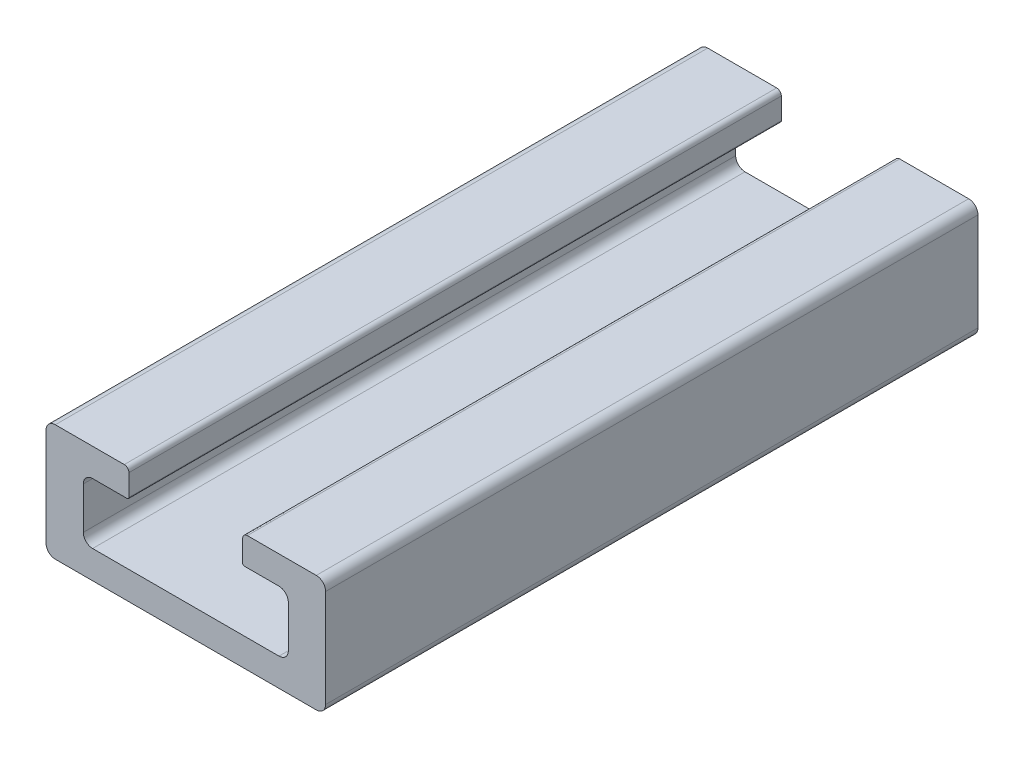
ISO-10303-21;
HEADER;
FILE_DESCRIPTION(('STEP AP214'),'2;1');
FILE_NAME('part.step','',(''),(''),'','','');
FILE_SCHEMA(('AUTOMOTIVE_DESIGN { 1 0 10303 214 1 1 1 1 }'));
ENDSEC;
DATA;
#1=APPLICATION_CONTEXT('core data for automotive mechanical design processes');
#2=APPLICATION_PROTOCOL_DEFINITION('international standard','automotive_design',2000,#1);
#3=PRODUCT_CONTEXT('',#1,'mechanical');
#4=PRODUCT('Part','Part','',(#3));
#5=PRODUCT_RELATED_PRODUCT_CATEGORY('part','',(#4));
#6=PRODUCT_DEFINITION_FORMATION('','',#4);
#7=PRODUCT_DEFINITION_CONTEXT('part definition',#1,'design');
#8=PRODUCT_DEFINITION('design','',#6,#7);
#9=PRODUCT_DEFINITION_SHAPE('','',#8);
#10=(LENGTH_UNIT() NAMED_UNIT(*) SI_UNIT(.MILLI.,.METRE.));
#11=(NAMED_UNIT(*) PLANE_ANGLE_UNIT() SI_UNIT($,.RADIAN.));
#12=(NAMED_UNIT(*) SI_UNIT($,.STERADIAN.) SOLID_ANGLE_UNIT());
#13=UNCERTAINTY_MEASURE_WITH_UNIT(LENGTH_MEASURE(1.E-05),#10,'distance_accuracy_value','');
#14=(GEOMETRIC_REPRESENTATION_CONTEXT(3) GLOBAL_UNCERTAINTY_ASSIGNED_CONTEXT((#13)) GLOBAL_UNIT_ASSIGNED_CONTEXT((#10,
#11,#12)) REPRESENTATION_CONTEXT('',''));
#15=CARTESIAN_POINT('',(0.,0.,0.));
#16=DIRECTION('',(0.,0.,1.));
#17=DIRECTION('',(1.,0.,0.));
#18=AXIS2_PLACEMENT_3D('',#15,#16,#17);
#19=CARTESIAN_POINT('',(-14.,-6.25,35.));
#20=DIRECTION('',(0.,1.,0.));
#21=DIRECTION('',(0.,0.,1.));
#22=AXIS2_PLACEMENT_3D('',#19,#20,#21);
#23=PLANE('',#22);
#24=CARTESIAN_POINT('',(0.,-6.25,20.));
#25=DIRECTION('',(0.,1.,0.));
#26=DIRECTION('',(0.,0.,1.));
#27=AXIS2_PLACEMENT_3D('',#24,#25,#26);
#28=CIRCLE('',#27,1.75);
#29=CARTESIAN_POINT('',(0.,-6.25,21.75));
#30=VERTEX_POINT('',#29);
#31=EDGE_CURVE('E822',#30,#30,#28,.T.);
#32=ORIENTED_EDGE('',*,*,#31,.T.);
#33=EDGE_LOOP('',(#32));
#34=FACE_BOUND('',#33,.T.);
#35=DIRECTION('',(0.,0.,-1.));
#36=VECTOR('',#35,1.);
#37=CARTESIAN_POINT('',(-14.,-6.25,35.));
#38=LINE('',#37,#36);
#39=CARTESIAN_POINT('',(-14.,-6.25,35.));
#40=VERTEX_POINT('',#39);
#41=CARTESIAN_POINT('',(-14.,-6.25,-35.));
#42=VERTEX_POINT('',#41);
#43=EDGE_CURVE('E371',#40,#42,#38,.T.);
#44=ORIENTED_EDGE('',*,*,#43,.T.);
#45=DIRECTION('',(1.,0.,0.));
#46=VECTOR('',#45,1.);
#47=CARTESIAN_POINT('',(-14.,-6.25,-35.));
#48=LINE('',#47,#46);
#49=CARTESIAN_POINT('',(14.,-6.25,-35.));
#50=VERTEX_POINT('',#49);
#51=EDGE_CURVE('E223',#42,#50,#48,.T.);
#52=ORIENTED_EDGE('',*,*,#51,.T.);
#53=DIRECTION('',(0.,0.,-1.));
#54=VECTOR('',#53,1.);
#55=CARTESIAN_POINT('',(14.,-6.25,35.));
#56=LINE('',#55,#54);
#57=CARTESIAN_POINT('',(14.,-6.25,35.));
#58=VERTEX_POINT('',#57);
#59=EDGE_CURVE('E369',#58,#50,#56,.T.);
#60=ORIENTED_EDGE('',*,*,#59,.F.);
#61=DIRECTION('',(1.,0.,0.));
#62=VECTOR('',#61,1.);
#63=CARTESIAN_POINT('',(-14.,-6.25,35.));
#64=LINE('',#63,#62);
#65=EDGE_CURVE('E290',#40,#58,#64,.T.);
#66=ORIENTED_EDGE('',*,*,#65,.F.);
#67=EDGE_LOOP('',(#44,#52,#60,#66));
#68=FACE_BOUND('',#67,.T.);
#69=CARTESIAN_POINT('',(0.,-6.25,-20.));
#70=DIRECTION('',(0.,1.,0.));
#71=DIRECTION('',(0.,0.,1.));
#72=AXIS2_PLACEMENT_3D('',#69,#70,#71);
#73=CIRCLE('',#72,1.75);
#74=CARTESIAN_POINT('',(0.,-6.25,-18.25));
#75=VERTEX_POINT('',#74);
#76=EDGE_CURVE('E834',#75,#75,#73,.T.);
#77=ORIENTED_EDGE('',*,*,#76,.T.);
#78=EDGE_LOOP('',(#77));
#79=FACE_BOUND('',#78,.T.);
#80=ADVANCED_FACE('F35',(#34,#68,#79),#23,.F.);
#81=CARTESIAN_POINT('',(10.,-3.25,35.));
#82=DIRECTION('',(0.,-1.,0.));
#83=DIRECTION('',(0.,0.,-1.));
#84=AXIS2_PLACEMENT_3D('',#81,#82,#83);
#85=PLANE('',#84);
#86=CARTESIAN_POINT('',(0.,-3.25,20.));
#87=DIRECTION('',(0.,1.,0.));
#88=DIRECTION('',(0.,0.,1.));
#89=AXIS2_PLACEMENT_3D('',#86,#87,#88);
#90=CIRCLE('',#89,3.);
#91=CARTESIAN_POINT('',(0.,-3.25,23.));
#92=VERTEX_POINT('',#91);
#93=EDGE_CURVE('E215',#92,#92,#90,.T.);
#94=ORIENTED_EDGE('',*,*,#93,.F.);
#95=EDGE_LOOP('',(#94));
#96=FACE_BOUND('',#95,.T.);
#97=DIRECTION('',(0.,0.,-1.));
#98=VECTOR('',#97,1.);
#99=CARTESIAN_POINT('',(10.,-3.25,35.));
#100=LINE('',#99,#98);
#101=CARTESIAN_POINT('',(10.,-3.25,35.));
#102=VERTEX_POINT('',#101);
#103=CARTESIAN_POINT('',(10.,-3.25,-35.));
#104=VERTEX_POINT('',#103);
#105=EDGE_CURVE('E347',#102,#104,#100,.T.);
#106=ORIENTED_EDGE('',*,*,#105,.T.);
#107=DIRECTION('',(-1.,0.,0.));
#108=VECTOR('',#107,1.);
#109=CARTESIAN_POINT('',(10.,-3.25,-35.));
#110=LINE('',#109,#108);
#111=CARTESIAN_POINT('',(-10.,-3.25,-35.));
#112=VERTEX_POINT('',#111);
#113=EDGE_CURVE('E259',#104,#112,#110,.T.);
#114=ORIENTED_EDGE('',*,*,#113,.T.);
#115=DIRECTION('',(0.,0.,-1.));
#116=VECTOR('',#115,1.);
#117=CARTESIAN_POINT('',(-10.,-3.25,35.));
#118=LINE('',#117,#116);
#119=CARTESIAN_POINT('',(-10.,-3.25,35.));
#120=VERTEX_POINT('',#119);
#121=EDGE_CURVE('E345',#120,#112,#118,.T.);
#122=ORIENTED_EDGE('',*,*,#121,.F.);
#123=DIRECTION('',(-1.,0.,0.));
#124=VECTOR('',#123,1.);
#125=CARTESIAN_POINT('',(10.,-3.25,35.));
#126=LINE('',#125,#124);
#127=EDGE_CURVE('E314',#102,#120,#126,.T.);
#128=ORIENTED_EDGE('',*,*,#127,.F.);
#129=EDGE_LOOP('',(#106,#114,#122,#128));
#130=FACE_BOUND('',#129,.T.);
#131=CARTESIAN_POINT('',(0.,-3.25,-20.));
#132=DIRECTION('',(0.,1.,0.));
#133=DIRECTION('',(0.,0.,1.));
#134=AXIS2_PLACEMENT_3D('',#131,#132,#133);
#135=CIRCLE('',#134,3.);
#136=CARTESIAN_POINT('',(0.,-3.25,-17.));
#137=VERTEX_POINT('',#136);
#138=EDGE_CURVE('E826',#137,#137,#135,.T.);
#139=ORIENTED_EDGE('',*,*,#138,.F.);
#140=EDGE_LOOP('',(#139));
#141=FACE_BOUND('',#140,.T.);
#142=ADVANCED_FACE('F441',(#96,#130,#141),#85,.F.);
#143=CARTESIAN_POINT('',(-14.0000000000007,5.25000000000069,35.));
#144=DIRECTION('',(0.,0.,-1.));
#145=DIRECTION('',(-1.,0.,0.));
#146=AXIS2_PLACEMENT_3D('',#143,#144,#145);
#147=CYLINDRICAL_SURFACE('',#146,0.999999999999307);
#148=DIRECTION('',(0.,0.,-1.));
#149=VECTOR('',#148,1.);
#150=CARTESIAN_POINT('',(-14.,6.25,35.));
#151=LINE('',#150,#149);
#152=CARTESIAN_POINT('',(-14.,6.25,35.));
#153=VERTEX_POINT('',#152);
#154=CARTESIAN_POINT('',(-14.,6.25,-35.));
#155=VERTEX_POINT('',#154);
#156=EDGE_CURVE('E214',#153,#155,#151,.T.);
#157=ORIENTED_EDGE('',*,*,#156,.T.);
#158=CARTESIAN_POINT('',(-14.0000000000007,5.25000000000069,-35.));
#159=DIRECTION('',(0.,0.,1.));
#160=DIRECTION('',(1.,0.,0.));
#161=AXIS2_PLACEMENT_3D('',#158,#159,#160);
#162=CIRCLE('',#161,0.999999999999307);
#163=CARTESIAN_POINT('',(-15.,5.25,-35.));
#164=VERTEX_POINT('',#163);
#165=EDGE_CURVE('E208',#155,#164,#162,.T.);
#166=ORIENTED_EDGE('',*,*,#165,.T.);
#167=DIRECTION('',(0.,0.,-1.));
#168=VECTOR('',#167,1.);
#169=CARTESIAN_POINT('',(-15.,5.25,35.));
#170=LINE('',#169,#168);
#171=CARTESIAN_POINT('',(-15.,5.25,35.));
#172=VERTEX_POINT('',#171);
#173=EDGE_CURVE('E11',#172,#164,#170,.T.);
#174=ORIENTED_EDGE('',*,*,#173,.F.);
#175=CARTESIAN_POINT('',(-14.0000000000007,5.25000000000069,35.));
#176=DIRECTION('',(0.,0.,1.));
#177=DIRECTION('',(1.,0.,0.));
#178=AXIS2_PLACEMENT_3D('',#175,#176,#177);
#179=CIRCLE('',#178,0.999999999999307);
#180=EDGE_CURVE('E285',#153,#172,#179,.T.);
#181=ORIENTED_EDGE('',*,*,#180,.F.);
#182=EDGE_LOOP('',(#157,#166,#174,#181));
#183=FACE_BOUND('',#182,.T.);
#184=ADVANCED_FACE('F37',(#183),#147,.T.);
#185=CARTESIAN_POINT('',(-15.,5.25,35.));
#186=DIRECTION('',(1.,0.,0.));
#187=DIRECTION('',(0.,0.,-1.));
#188=AXIS2_PLACEMENT_3D('',#185,#186,#187);
#189=PLANE('',#188);
#190=ORIENTED_EDGE('',*,*,#173,.T.);
#191=DIRECTION('',(0.,-1.,0.));
#192=VECTOR('',#191,1.);
#193=CARTESIAN_POINT('',(-15.,5.25,-35.));
#194=LINE('',#193,#192);
#195=CARTESIAN_POINT('',(-15.,-5.25,-35.));
#196=VERTEX_POINT('',#195);
#197=EDGE_CURVE('E198',#164,#196,#194,.T.);
#198=ORIENTED_EDGE('',*,*,#197,.T.);
#199=DIRECTION('',(0.,0.,-1.));
#200=VECTOR('',#199,1.);
#201=CARTESIAN_POINT('',(-15.,-5.25,35.));
#202=LINE('',#201,#200);
#203=CARTESIAN_POINT('',(-15.,-5.25,35.));
#204=VERTEX_POINT('',#203);
#205=EDGE_CURVE('E43',#204,#196,#202,.T.);
#206=ORIENTED_EDGE('',*,*,#205,.F.);
#207=DIRECTION('',(0.,-1.,0.));
#208=VECTOR('',#207,1.);
#209=CARTESIAN_POINT('',(-15.,5.25,35.));
#210=LINE('',#209,#208);
#211=EDGE_CURVE('E199',#172,#204,#210,.T.);
#212=ORIENTED_EDGE('',*,*,#211,.F.);
#213=EDGE_LOOP('',(#190,#198,#206,#212));
#214=FACE_BOUND('',#213,.T.);
#215=ADVANCED_FACE('F196',(#214),#189,.F.);
#216=CARTESIAN_POINT('',(-14.0000000000007,-5.25000000000069,35.));
#217=DIRECTION('',(0.,0.,-1.));
#218=DIRECTION('',(-1.,0.,0.));
#219=AXIS2_PLACEMENT_3D('',#216,#217,#218);
#220=CYLINDRICAL_SURFACE('',#219,0.99999999999931);
#221=ORIENTED_EDGE('',*,*,#205,.T.);
#222=CARTESIAN_POINT('',(-14.0000000000007,-5.25000000000069,-35.));
#223=DIRECTION('',(0.,0.,1.));
#224=DIRECTION('',(1.,0.,0.));
#225=AXIS2_PLACEMENT_3D('',#222,#223,#224);
#226=CIRCLE('',#225,0.99999999999931);
#227=EDGE_CURVE('E212',#196,#42,#226,.T.);
#228=ORIENTED_EDGE('',*,*,#227,.T.);
#229=ORIENTED_EDGE('',*,*,#43,.F.);
#230=CARTESIAN_POINT('',(-14.0000000000007,-5.25000000000069,35.));
#231=DIRECTION('',(0.,0.,1.));
#232=DIRECTION('',(1.,0.,0.));
#233=AXIS2_PLACEMENT_3D('',#230,#231,#232);
#234=CIRCLE('',#233,0.99999999999931);
#235=EDGE_CURVE('E288',#204,#40,#234,.T.);
#236=ORIENTED_EDGE('',*,*,#235,.F.);
#237=EDGE_LOOP('',(#221,#228,#229,#236));
#238=FACE_BOUND('',#237,.T.);
#239=ADVANCED_FACE('F374',(#238),#220,.T.);
#240=CARTESIAN_POINT('',(14.0000000000007,-5.25000000000069,35.));
#241=DIRECTION('',(0.,0.,-1.));
#242=DIRECTION('',(-1.,0.,0.));
#243=AXIS2_PLACEMENT_3D('',#240,#241,#242);
#244=CYLINDRICAL_SURFACE('',#243,0.999999999999307);
#245=ORIENTED_EDGE('',*,*,#59,.T.);
#246=CARTESIAN_POINT('',(14.0000000000007,-5.25000000000069,-35.));
#247=DIRECTION('',(0.,0.,1.));
#248=DIRECTION('',(1.,0.,0.));
#249=AXIS2_PLACEMENT_3D('',#246,#247,#248);
#250=CIRCLE('',#249,0.999999999999307);
#251=CARTESIAN_POINT('',(15.,-5.25,-35.));
#252=VERTEX_POINT('',#251);
#253=EDGE_CURVE('E226',#50,#252,#250,.T.);
#254=ORIENTED_EDGE('',*,*,#253,.T.);
#255=DIRECTION('',(0.,0.,-1.));
#256=VECTOR('',#255,1.);
#257=CARTESIAN_POINT('',(15.,-5.25,35.));
#258=LINE('',#257,#256);
#259=CARTESIAN_POINT('',(15.,-5.25,35.));
#260=VERTEX_POINT('',#259);
#261=EDGE_CURVE('E367',#260,#252,#258,.T.);
#262=ORIENTED_EDGE('',*,*,#261,.F.);
#263=CARTESIAN_POINT('',(14.0000000000007,-5.25000000000069,35.));
#264=DIRECTION('',(0.,0.,1.));
#265=DIRECTION('',(1.,0.,0.));
#266=AXIS2_PLACEMENT_3D('',#263,#264,#265);
#267=CIRCLE('',#266,0.999999999999307);
#268=EDGE_CURVE('E292',#58,#260,#267,.T.);
#269=ORIENTED_EDGE('',*,*,#268,.F.);
#270=EDGE_LOOP('',(#245,#254,#262,#269));
#271=FACE_BOUND('',#270,.T.);
#272=ADVANCED_FACE('F385',(#271),#244,.T.);
#273=CARTESIAN_POINT('',(15.,-5.25,35.));
#274=DIRECTION('',(-1.,0.,0.));
#275=DIRECTION('',(0.,0.,1.));
#276=AXIS2_PLACEMENT_3D('',#273,#274,#275);
#277=PLANE('',#276);
#278=ORIENTED_EDGE('',*,*,#261,.T.);
#279=DIRECTION('',(0.,1.,0.));
#280=VECTOR('',#279,1.);
#281=CARTESIAN_POINT('',(15.,-5.25,-35.));
#282=LINE('',#281,#280);
#283=CARTESIAN_POINT('',(15.,5.25,-35.));
#284=VERTEX_POINT('',#283);
#285=EDGE_CURVE('E229',#252,#284,#282,.T.);
#286=ORIENTED_EDGE('',*,*,#285,.T.);
#287=DIRECTION('',(0.,0.,-1.));
#288=VECTOR('',#287,1.);
#289=CARTESIAN_POINT('',(15.,5.25,35.));
#290=LINE('',#289,#288);
#291=CARTESIAN_POINT('',(15.,5.25,35.));
#292=VERTEX_POINT('',#291);
#293=EDGE_CURVE('E365',#292,#284,#290,.T.);
#294=ORIENTED_EDGE('',*,*,#293,.F.);
#295=DIRECTION('',(0.,1.,0.));
#296=VECTOR('',#295,1.);
#297=CARTESIAN_POINT('',(15.,-5.25,35.));
#298=LINE('',#297,#296);
#299=EDGE_CURVE('E294',#260,#292,#298,.T.);
#300=ORIENTED_EDGE('',*,*,#299,.F.);
#301=EDGE_LOOP('',(#278,#286,#294,#300));
#302=FACE_BOUND('',#301,.T.);
#303=ADVANCED_FACE('F390',(#302),#277,.F.);
#304=CARTESIAN_POINT('',(14.0000000000007,5.25000000000069,35.));
#305=DIRECTION('',(0.,0.,-1.));
#306=DIRECTION('',(-1.,0.,0.));
#307=AXIS2_PLACEMENT_3D('',#304,#305,#306);
#308=CYLINDRICAL_SURFACE('',#307,0.99999999999931);
#309=ORIENTED_EDGE('',*,*,#293,.T.);
#310=CARTESIAN_POINT('',(14.0000000000007,5.25000000000069,-35.));
#311=DIRECTION('',(0.,0.,1.));
#312=DIRECTION('',(1.,0.,0.));
#313=AXIS2_PLACEMENT_3D('',#310,#311,#312);
#314=CIRCLE('',#313,0.99999999999931);
#315=CARTESIAN_POINT('',(14.,6.25,-35.));
#316=VERTEX_POINT('',#315);
#317=EDGE_CURVE('E232',#284,#316,#314,.T.);
#318=ORIENTED_EDGE('',*,*,#317,.T.);
#319=DIRECTION('',(0.,0.,-1.));
#320=VECTOR('',#319,1.);
#321=CARTESIAN_POINT('',(14.,6.25,35.));
#322=LINE('',#321,#320);
#323=CARTESIAN_POINT('',(14.,6.25,35.));
#324=VERTEX_POINT('',#323);
#325=EDGE_CURVE('E363',#324,#316,#322,.T.);
#326=ORIENTED_EDGE('',*,*,#325,.F.);
#327=CARTESIAN_POINT('',(14.0000000000007,5.25000000000069,35.));
#328=DIRECTION('',(0.,0.,1.));
#329=DIRECTION('',(1.,0.,0.));
#330=AXIS2_PLACEMENT_3D('',#327,#328,#329);
#331=CIRCLE('',#330,0.99999999999931);
#332=EDGE_CURVE('E296',#292,#324,#331,.T.);
#333=ORIENTED_EDGE('',*,*,#332,.F.);
#334=EDGE_LOOP('',(#309,#318,#326,#333));
#335=FACE_BOUND('',#334,.T.);
#336=ADVANCED_FACE('F396',(#335),#308,.T.);
#337=CARTESIAN_POINT('',(14.,6.25,35.));
#338=DIRECTION('',(0.,-1.,0.));
#339=DIRECTION('',(0.,0.,-1.));
#340=AXIS2_PLACEMENT_3D('',#337,#338,#339);
#341=PLANE('',#340);
#342=ORIENTED_EDGE('',*,*,#325,.T.);
#343=DIRECTION('',(-1.,0.,0.));
#344=VECTOR('',#343,1.);
#345=CARTESIAN_POINT('',(14.,6.25,-35.));
#346=LINE('',#345,#344);
#347=CARTESIAN_POINT('',(6.6,6.25,-35.));
#348=VERTEX_POINT('',#347);
#349=EDGE_CURVE('E235',#316,#348,#346,.T.);
#350=ORIENTED_EDGE('',*,*,#349,.T.);
#351=DIRECTION('',(0.,0.,-1.));
#352=VECTOR('',#351,1.);
#353=CARTESIAN_POINT('',(6.6,6.25,35.));
#354=LINE('',#353,#352);
#355=CARTESIAN_POINT('',(6.6,6.25,35.));
#356=VERTEX_POINT('',#355);
#357=EDGE_CURVE('E361',#356,#348,#354,.T.);
#358=ORIENTED_EDGE('',*,*,#357,.F.);
#359=DIRECTION('',(-1.,0.,0.));
#360=VECTOR('',#359,1.);
#361=CARTESIAN_POINT('',(14.,6.25,35.));
#362=LINE('',#361,#360);
#363=EDGE_CURVE('E298',#324,#356,#362,.T.);
#364=ORIENTED_EDGE('',*,*,#363,.F.);
#365=EDGE_LOOP('',(#342,#350,#358,#364));
#366=FACE_BOUND('',#365,.T.);
#367=ADVANCED_FACE('F400',(#366),#341,.F.);
#368=CARTESIAN_POINT('',(6.59999999999991,5.75000000000009,35.));
#369=DIRECTION('',(0.,0.,-1.));
#370=DIRECTION('',(-1.,0.,0.));
#371=AXIS2_PLACEMENT_3D('',#368,#369,#370);
#372=CYLINDRICAL_SURFACE('',#371,0.49999999999991);
#373=ORIENTED_EDGE('',*,*,#357,.T.);
#374=CARTESIAN_POINT('',(6.59999999999991,5.75000000000009,-35.));
#375=DIRECTION('',(0.,0.,1.));
#376=DIRECTION('',(1.,0.,0.));
#377=AXIS2_PLACEMENT_3D('',#374,#375,#376);
#378=CIRCLE('',#377,0.49999999999991);
#379=CARTESIAN_POINT('',(6.1,5.75,-35.));
#380=VERTEX_POINT('',#379);
#381=EDGE_CURVE('E238',#348,#380,#378,.T.);
#382=ORIENTED_EDGE('',*,*,#381,.T.);
#383=DIRECTION('',(0.,0.,-1.));
#384=VECTOR('',#383,1.);
#385=CARTESIAN_POINT('',(6.1,5.75,35.));
#386=LINE('',#385,#384);
#387=CARTESIAN_POINT('',(6.1,5.75,35.));
#388=VERTEX_POINT('',#387);
#389=EDGE_CURVE('E359',#388,#380,#386,.T.);
#390=ORIENTED_EDGE('',*,*,#389,.F.);
#391=CARTESIAN_POINT('',(6.59999999999991,5.75000000000009,35.));
#392=DIRECTION('',(0.,0.,1.));
#393=DIRECTION('',(1.,0.,0.));
#394=AXIS2_PLACEMENT_3D('',#391,#392,#393);
#395=CIRCLE('',#394,0.49999999999991);
#396=EDGE_CURVE('E300',#356,#388,#395,.T.);
#397=ORIENTED_EDGE('',*,*,#396,.F.);
#398=EDGE_LOOP('',(#373,#382,#390,#397));
#399=FACE_BOUND('',#398,.T.);
#400=ADVANCED_FACE('F405',(#399),#372,.T.);
#401=CARTESIAN_POINT('',(6.1,5.75,35.));
#402=DIRECTION('',(1.,0.,0.));
#403=DIRECTION('',(0.,0.,-1.));
#404=AXIS2_PLACEMENT_3D('',#401,#402,#403);
#405=PLANE('',#404);
#406=ORIENTED_EDGE('',*,*,#389,.T.);
#407=DIRECTION('',(0.,-1.,0.));
#408=VECTOR('',#407,1.);
#409=CARTESIAN_POINT('',(6.1,5.75,-35.));
#410=LINE('',#409,#408);
#411=CARTESIAN_POINT('',(6.1,3.45,-35.));
#412=VERTEX_POINT('',#411);
#413=EDGE_CURVE('E241',#380,#412,#410,.T.);
#414=ORIENTED_EDGE('',*,*,#413,.T.);
#415=DIRECTION('',(0.,0.,-1.));
#416=VECTOR('',#415,1.);
#417=CARTESIAN_POINT('',(6.1,3.45,35.));
#418=LINE('',#417,#416);
#419=CARTESIAN_POINT('',(6.1,3.45,35.));
#420=VERTEX_POINT('',#419);
#421=EDGE_CURVE('E357',#420,#412,#418,.T.);
#422=ORIENTED_EDGE('',*,*,#421,.F.);
#423=DIRECTION('',(0.,-1.,0.));
#424=VECTOR('',#423,1.);
#425=CARTESIAN_POINT('',(6.1,5.75,35.));
#426=LINE('',#425,#424);
#427=EDGE_CURVE('E302',#388,#420,#426,.T.);
#428=ORIENTED_EDGE('',*,*,#427,.F.);
#429=EDGE_LOOP('',(#406,#414,#422,#428));
#430=FACE_BOUND('',#429,.T.);
#431=ADVANCED_FACE('F411',(#430),#405,.F.);
#432=CARTESIAN_POINT('',(6.30000000000003,3.45000000000003,35.));
#433=DIRECTION('',(0.,0.,-1.));
#434=DIRECTION('',(-1.,0.,0.));
#435=AXIS2_PLACEMENT_3D('',#432,#433,#434);
#436=CYLINDRICAL_SURFACE('',#435,0.200000000000032);
#437=ORIENTED_EDGE('',*,*,#421,.T.);
#438=CARTESIAN_POINT('',(6.30000000000003,3.45000000000003,-35.));
#439=DIRECTION('',(0.,0.,1.));
#440=DIRECTION('',(1.,0.,0.));
#441=AXIS2_PLACEMENT_3D('',#438,#439,#440);
#442=CIRCLE('',#441,0.200000000000032);
#443=CARTESIAN_POINT('',(6.3,3.25,-35.));
#444=VERTEX_POINT('',#443);
#445=EDGE_CURVE('E244',#412,#444,#442,.T.);
#446=ORIENTED_EDGE('',*,*,#445,.T.);
#447=DIRECTION('',(0.,0.,-1.));
#448=VECTOR('',#447,1.);
#449=CARTESIAN_POINT('',(6.3,3.25,35.));
#450=LINE('',#449,#448);
#451=CARTESIAN_POINT('',(6.3,3.25,35.));
#452=VERTEX_POINT('',#451);
#453=EDGE_CURVE('E355',#452,#444,#450,.T.);
#454=ORIENTED_EDGE('',*,*,#453,.F.);
#455=CARTESIAN_POINT('',(6.30000000000003,3.45000000000003,35.));
#456=DIRECTION('',(0.,0.,1.));
#457=DIRECTION('',(1.,0.,0.));
#458=AXIS2_PLACEMENT_3D('',#455,#456,#457);
#459=CIRCLE('',#458,0.200000000000032);
#460=EDGE_CURVE('E304',#420,#452,#459,.T.);
#461=ORIENTED_EDGE('',*,*,#460,.F.);
#462=EDGE_LOOP('',(#437,#446,#454,#461));
#463=FACE_BOUND('',#462,.T.);
#464=ADVANCED_FACE('F415',(#463),#436,.T.);
#465=CARTESIAN_POINT('',(6.3,3.25,35.));
#466=DIRECTION('',(0.,1.,0.));
#467=DIRECTION('',(0.,0.,1.));
#468=AXIS2_PLACEMENT_3D('',#465,#466,#467);
#469=PLANE('',#468);
#470=ORIENTED_EDGE('',*,*,#453,.T.);
#471=DIRECTION('',(1.,0.,0.));
#472=VECTOR('',#471,1.);
#473=CARTESIAN_POINT('',(6.3,3.25,-35.));
#474=LINE('',#473,#472);
#475=CARTESIAN_POINT('',(10.,3.25,-35.));
#476=VERTEX_POINT('',#475);
#477=EDGE_CURVE('E247',#444,#476,#474,.T.);
#478=ORIENTED_EDGE('',*,*,#477,.T.);
#479=DIRECTION('',(0.,0.,-1.));
#480=VECTOR('',#479,1.);
#481=CARTESIAN_POINT('',(10.,3.25,35.));
#482=LINE('',#481,#480);
#483=CARTESIAN_POINT('',(10.,3.25,35.));
#484=VERTEX_POINT('',#483);
#485=EDGE_CURVE('E353',#484,#476,#482,.T.);
#486=ORIENTED_EDGE('',*,*,#485,.F.);
#487=DIRECTION('',(1.,0.,0.));
#488=VECTOR('',#487,1.);
#489=CARTESIAN_POINT('',(6.3,3.25,35.));
#490=LINE('',#489,#488);
#491=EDGE_CURVE('E306',#452,#484,#490,.T.);
#492=ORIENTED_EDGE('',*,*,#491,.F.);
#493=EDGE_LOOP('',(#470,#478,#486,#492));
#494=FACE_BOUND('',#493,.T.);
#495=ADVANCED_FACE('F420',(#494),#469,.F.);
#496=CARTESIAN_POINT('',(10.0000000000007,2.25000000000069,35.));
#497=DIRECTION('',(0.,0.,-1.));
#498=DIRECTION('',(-1.,0.,0.));
#499=AXIS2_PLACEMENT_3D('',#496,#497,#498);
#500=CYLINDRICAL_SURFACE('',#499,0.999999999999307);
#501=ORIENTED_EDGE('',*,*,#485,.T.);
#502=CARTESIAN_POINT('',(10.0000000000007,2.25000000000069,-35.));
#503=DIRECTION('',(0.,0.,-1.));
#504=DIRECTION('',(-1.,0.,0.));
#505=AXIS2_PLACEMENT_3D('',#502,#503,#504);
#506=CIRCLE('',#505,0.999999999999307);
#507=CARTESIAN_POINT('',(11.,2.25,-35.));
#508=VERTEX_POINT('',#507);
#509=EDGE_CURVE('E250',#476,#508,#506,.T.);
#510=ORIENTED_EDGE('',*,*,#509,.T.);
#511=DIRECTION('',(0.,0.,-1.));
#512=VECTOR('',#511,1.);
#513=CARTESIAN_POINT('',(11.,2.25,35.));
#514=LINE('',#513,#512);
#515=CARTESIAN_POINT('',(11.,2.25,35.));
#516=VERTEX_POINT('',#515);
#517=EDGE_CURVE('E351',#516,#508,#514,.T.);
#518=ORIENTED_EDGE('',*,*,#517,.F.);
#519=CARTESIAN_POINT('',(10.0000000000007,2.25000000000069,35.));
#520=DIRECTION('',(0.,0.,-1.));
#521=DIRECTION('',(-1.,0.,0.));
#522=AXIS2_PLACEMENT_3D('',#519,#520,#521);
#523=CIRCLE('',#522,0.999999999999307);
#524=EDGE_CURVE('E308',#484,#516,#523,.T.);
#525=ORIENTED_EDGE('',*,*,#524,.F.);
#526=EDGE_LOOP('',(#501,#510,#518,#525));
#527=FACE_BOUND('',#526,.T.);
#528=ADVANCED_FACE('F426',(#527),#500,.F.);
#529=CARTESIAN_POINT('',(11.,2.25,35.));
#530=DIRECTION('',(1.,0.,0.));
#531=DIRECTION('',(0.,0.,-1.));
#532=AXIS2_PLACEMENT_3D('',#529,#530,#531);
#533=PLANE('',#532);
#534=ORIENTED_EDGE('',*,*,#517,.T.);
#535=DIRECTION('',(0.,-1.,0.));
#536=VECTOR('',#535,1.);
#537=CARTESIAN_POINT('',(11.,2.25,-35.));
#538=LINE('',#537,#536);
#539=CARTESIAN_POINT('',(11.,-2.25,-35.));
#540=VERTEX_POINT('',#539);
#541=EDGE_CURVE('E253',#508,#540,#538,.T.);
#542=ORIENTED_EDGE('',*,*,#541,.T.);
#543=DIRECTION('',(0.,0.,-1.));
#544=VECTOR('',#543,1.);
#545=CARTESIAN_POINT('',(11.,-2.25,35.));
#546=LINE('',#545,#544);
#547=CARTESIAN_POINT('',(11.,-2.25,35.));
#548=VERTEX_POINT('',#547);
#549=EDGE_CURVE('E349',#548,#540,#546,.T.);
#550=ORIENTED_EDGE('',*,*,#549,.F.);
#551=DIRECTION('',(0.,-1.,0.));
#552=VECTOR('',#551,1.);
#553=CARTESIAN_POINT('',(11.,2.25,35.));
#554=LINE('',#553,#552);
#555=EDGE_CURVE('E310',#516,#548,#554,.T.);
#556=ORIENTED_EDGE('',*,*,#555,.F.);
#557=EDGE_LOOP('',(#534,#542,#550,#556));
#558=FACE_BOUND('',#557,.T.);
#559=ADVANCED_FACE('F430',(#558),#533,.F.);
#560=CARTESIAN_POINT('',(10.0000000000007,-2.25000000000069,35.));
#561=DIRECTION('',(0.,0.,-1.));
#562=DIRECTION('',(-1.,0.,0.));
#563=AXIS2_PLACEMENT_3D('',#560,#561,#562);
#564=CYLINDRICAL_SURFACE('',#563,0.99999999999931);
#565=ORIENTED_EDGE('',*,*,#549,.T.);
#566=CARTESIAN_POINT('',(10.0000000000007,-2.25000000000069,-35.));
#567=DIRECTION('',(0.,0.,-1.));
#568=DIRECTION('',(-1.,0.,0.));
#569=AXIS2_PLACEMENT_3D('',#566,#567,#568);
#570=CIRCLE('',#569,0.99999999999931);
#571=EDGE_CURVE('E256',#540,#104,#570,.T.);
#572=ORIENTED_EDGE('',*,*,#571,.T.);
#573=ORIENTED_EDGE('',*,*,#105,.F.);
#574=CARTESIAN_POINT('',(10.0000000000007,-2.25000000000069,35.));
#575=DIRECTION('',(0.,0.,-1.));
#576=DIRECTION('',(-1.,0.,0.));
#577=AXIS2_PLACEMENT_3D('',#574,#575,#576);
#578=CIRCLE('',#577,0.99999999999931);
#579=EDGE_CURVE('E312',#548,#102,#578,.T.);
#580=ORIENTED_EDGE('',*,*,#579,.F.);
#581=EDGE_LOOP('',(#565,#572,#573,#580));
#582=FACE_BOUND('',#581,.T.);
#583=ADVANCED_FACE('F435',(#582),#564,.F.);
#584=CARTESIAN_POINT('',(-10.0000000000007,-2.25000000000069,35.));
#585=DIRECTION('',(0.,0.,-1.));
#586=DIRECTION('',(-1.,0.,0.));
#587=AXIS2_PLACEMENT_3D('',#584,#585,#586);
#588=CYLINDRICAL_SURFACE('',#587,0.999999999999307);
#589=ORIENTED_EDGE('',*,*,#121,.T.);
#590=CARTESIAN_POINT('',(-10.0000000000007,-2.25000000000069,-35.));
#591=DIRECTION('',(0.,0.,-1.));
#592=DIRECTION('',(-1.,0.,0.));
#593=AXIS2_PLACEMENT_3D('',#590,#591,#592);
#594=CIRCLE('',#593,0.999999999999307);
#595=CARTESIAN_POINT('',(-11.,-2.25,-35.));
#596=VERTEX_POINT('',#595);
#597=EDGE_CURVE('E262',#112,#596,#594,.T.);
#598=ORIENTED_EDGE('',*,*,#597,.T.);
#599=DIRECTION('',(0.,0.,-1.));
#600=VECTOR('',#599,1.);
#601=CARTESIAN_POINT('',(-11.,-2.25,35.));
#602=LINE('',#601,#600);
#603=CARTESIAN_POINT('',(-11.,-2.25,35.));
#604=VERTEX_POINT('',#603);
#605=EDGE_CURVE('E343',#604,#596,#602,.T.);
#606=ORIENTED_EDGE('',*,*,#605,.F.);
#607=CARTESIAN_POINT('',(-10.0000000000007,-2.25000000000069,35.));
#608=DIRECTION('',(0.,0.,-1.));
#609=DIRECTION('',(-1.,0.,0.));
#610=AXIS2_PLACEMENT_3D('',#607,#608,#609);
#611=CIRCLE('',#610,0.999999999999307);
#612=EDGE_CURVE('E316',#120,#604,#611,.T.);
#613=ORIENTED_EDGE('',*,*,#612,.F.);
#614=EDGE_LOOP('',(#589,#598,#606,#613));
#615=FACE_BOUND('',#614,.T.);
#616=ADVANCED_FACE('F446',(#615),#588,.F.);
#617=CARTESIAN_POINT('',(-11.,-2.25,35.));
#618=DIRECTION('',(-1.,0.,0.));
#619=DIRECTION('',(0.,0.,1.));
#620=AXIS2_PLACEMENT_3D('',#617,#618,#619);
#621=PLANE('',#620);
#622=ORIENTED_EDGE('',*,*,#605,.T.);
#623=DIRECTION('',(0.,1.,0.));
#624=VECTOR('',#623,1.);
#625=CARTESIAN_POINT('',(-11.,-2.25,-35.));
#626=LINE('',#625,#624);
#627=CARTESIAN_POINT('',(-11.,2.25,-35.));
#628=VERTEX_POINT('',#627);
#629=EDGE_CURVE('E265',#596,#628,#626,.T.);
#630=ORIENTED_EDGE('',*,*,#629,.T.);
#631=DIRECTION('',(0.,0.,-1.));
#632=VECTOR('',#631,1.);
#633=CARTESIAN_POINT('',(-11.,2.25,35.));
#634=LINE('',#633,#632);
#635=CARTESIAN_POINT('',(-11.,2.25,35.));
#636=VERTEX_POINT('',#635);
#637=EDGE_CURVE('E341',#636,#628,#634,.T.);
#638=ORIENTED_EDGE('',*,*,#637,.F.);
#639=DIRECTION('',(0.,1.,0.));
#640=VECTOR('',#639,1.);
#641=CARTESIAN_POINT('',(-11.,-2.25,35.));
#642=LINE('',#641,#640);
#643=EDGE_CURVE('E318',#604,#636,#642,.T.);
#644=ORIENTED_EDGE('',*,*,#643,.F.);
#645=EDGE_LOOP('',(#622,#630,#638,#644));
#646=FACE_BOUND('',#645,.T.);
#647=ADVANCED_FACE('F451',(#646),#621,.F.);
#648=CARTESIAN_POINT('',(-10.0000000000007,2.25000000000069,35.));
#649=DIRECTION('',(0.,0.,-1.));
#650=DIRECTION('',(-1.,0.,0.));
#651=AXIS2_PLACEMENT_3D('',#648,#649,#650);
#652=CYLINDRICAL_SURFACE('',#651,0.99999999999931);
#653=ORIENTED_EDGE('',*,*,#637,.T.);
#654=CARTESIAN_POINT('',(-10.0000000000007,2.25000000000069,-35.));
#655=DIRECTION('',(0.,0.,-1.));
#656=DIRECTION('',(-1.,0.,0.));
#657=AXIS2_PLACEMENT_3D('',#654,#655,#656);
#658=CIRCLE('',#657,0.99999999999931);
#659=CARTESIAN_POINT('',(-10.,3.25,-35.));
#660=VERTEX_POINT('',#659);
#661=EDGE_CURVE('E268',#628,#660,#658,.T.);
#662=ORIENTED_EDGE('',*,*,#661,.T.);
#663=DIRECTION('',(0.,0.,-1.));
#664=VECTOR('',#663,1.);
#665=CARTESIAN_POINT('',(-10.,3.25,35.));
#666=LINE('',#665,#664);
#667=CARTESIAN_POINT('',(-10.,3.25,35.));
#668=VERTEX_POINT('',#667);
#669=EDGE_CURVE('E339',#668,#660,#666,.T.);
#670=ORIENTED_EDGE('',*,*,#669,.F.);
#671=CARTESIAN_POINT('',(-10.0000000000007,2.25000000000069,35.));
#672=DIRECTION('',(0.,0.,-1.));
#673=DIRECTION('',(-1.,0.,0.));
#674=AXIS2_PLACEMENT_3D('',#671,#672,#673);
#675=CIRCLE('',#674,0.99999999999931);
#676=EDGE_CURVE('E320',#636,#668,#675,.T.);
#677=ORIENTED_EDGE('',*,*,#676,.F.);
#678=EDGE_LOOP('',(#653,#662,#670,#677));
#679=FACE_BOUND('',#678,.T.);
#680=ADVANCED_FACE('F457',(#679),#652,.F.);
#681=CARTESIAN_POINT('',(-10.,3.25,35.));
#682=DIRECTION('',(0.,1.,0.));
#683=DIRECTION('',(0.,0.,1.));
#684=AXIS2_PLACEMENT_3D('',#681,#682,#683);
#685=PLANE('',#684);
#686=ORIENTED_EDGE('',*,*,#669,.T.);
#687=DIRECTION('',(1.,0.,0.));
#688=VECTOR('',#687,1.);
#689=CARTESIAN_POINT('',(-10.,3.25,-35.));
#690=LINE('',#689,#688);
#691=CARTESIAN_POINT('',(-6.3,3.25,-35.));
#692=VERTEX_POINT('',#691);
#693=EDGE_CURVE('E271',#660,#692,#690,.T.);
#694=ORIENTED_EDGE('',*,*,#693,.T.);
#695=DIRECTION('',(0.,0.,-1.));
#696=VECTOR('',#695,1.);
#697=CARTESIAN_POINT('',(-6.3,3.25,35.));
#698=LINE('',#697,#696);
#699=CARTESIAN_POINT('',(-6.3,3.25,35.));
#700=VERTEX_POINT('',#699);
#701=EDGE_CURVE('E337',#700,#692,#698,.T.);
#702=ORIENTED_EDGE('',*,*,#701,.F.);
#703=DIRECTION('',(1.,0.,0.));
#704=VECTOR('',#703,1.);
#705=CARTESIAN_POINT('',(-10.,3.25,35.));
#706=LINE('',#705,#704);
#707=EDGE_CURVE('E322',#668,#700,#706,.T.);
#708=ORIENTED_EDGE('',*,*,#707,.F.);
#709=EDGE_LOOP('',(#686,#694,#702,#708));
#710=FACE_BOUND('',#709,.T.);
#711=ADVANCED_FACE('F461',(#710),#685,.F.);
#712=CARTESIAN_POINT('',(-6.30000000000003,3.45000000000003,35.));
#713=DIRECTION('',(0.,0.,-1.));
#714=DIRECTION('',(-1.,0.,0.));
#715=AXIS2_PLACEMENT_3D('',#712,#713,#714);
#716=CYLINDRICAL_SURFACE('',#715,0.200000000000031);
#717=ORIENTED_EDGE('',*,*,#701,.T.);
#718=CARTESIAN_POINT('',(-6.30000000000003,3.45000000000003,-35.));
#719=DIRECTION('',(0.,0.,1.));
#720=DIRECTION('',(1.,0.,0.));
#721=AXIS2_PLACEMENT_3D('',#718,#719,#720);
#722=CIRCLE('',#721,0.200000000000031);
#723=CARTESIAN_POINT('',(-6.1,3.45,-35.));
#724=VERTEX_POINT('',#723);
#725=EDGE_CURVE('E274',#692,#724,#722,.T.);
#726=ORIENTED_EDGE('',*,*,#725,.T.);
#727=DIRECTION('',(0.,0.,-1.));
#728=VECTOR('',#727,1.);
#729=CARTESIAN_POINT('',(-6.1,3.45,35.));
#730=LINE('',#729,#728);
#731=CARTESIAN_POINT('',(-6.1,3.45,35.));
#732=VERTEX_POINT('',#731);
#733=EDGE_CURVE('E335',#732,#724,#730,.T.);
#734=ORIENTED_EDGE('',*,*,#733,.F.);
#735=CARTESIAN_POINT('',(-6.30000000000003,3.45000000000003,35.));
#736=DIRECTION('',(0.,0.,1.));
#737=DIRECTION('',(1.,0.,0.));
#738=AXIS2_PLACEMENT_3D('',#735,#736,#737);
#739=CIRCLE('',#738,0.200000000000031);
#740=EDGE_CURVE('E324',#700,#732,#739,.T.);
#741=ORIENTED_EDGE('',*,*,#740,.F.);
#742=EDGE_LOOP('',(#717,#726,#734,#741));
#743=FACE_BOUND('',#742,.T.);
#744=ADVANCED_FACE('F466',(#743),#716,.T.);
#745=CARTESIAN_POINT('',(-6.1,3.45,35.));
#746=DIRECTION('',(-1.,0.,0.));
#747=DIRECTION('',(0.,0.,1.));
#748=AXIS2_PLACEMENT_3D('',#745,#746,#747);
#749=PLANE('',#748);
#750=ORIENTED_EDGE('',*,*,#733,.T.);
#751=DIRECTION('',(0.,1.,0.));
#752=VECTOR('',#751,1.);
#753=CARTESIAN_POINT('',(-6.1,3.45,-35.));
#754=LINE('',#753,#752);
#755=CARTESIAN_POINT('',(-6.1,5.75,-35.));
#756=VERTEX_POINT('',#755);
#757=EDGE_CURVE('E277',#724,#756,#754,.T.);
#758=ORIENTED_EDGE('',*,*,#757,.T.);
#759=DIRECTION('',(0.,0.,-1.));
#760=VECTOR('',#759,1.);
#761=CARTESIAN_POINT('',(-6.1,5.75,35.));
#762=LINE('',#761,#760);
#763=CARTESIAN_POINT('',(-6.1,5.75,35.));
#764=VERTEX_POINT('',#763);
#765=EDGE_CURVE('E333',#764,#756,#762,.T.);
#766=ORIENTED_EDGE('',*,*,#765,.F.);
#767=DIRECTION('',(0.,1.,0.));
#768=VECTOR('',#767,1.);
#769=CARTESIAN_POINT('',(-6.1,3.45,35.));
#770=LINE('',#769,#768);
#771=EDGE_CURVE('E326',#732,#764,#770,.T.);
#772=ORIENTED_EDGE('',*,*,#771,.F.);
#773=EDGE_LOOP('',(#750,#758,#766,#772));
#774=FACE_BOUND('',#773,.T.);
#775=ADVANCED_FACE('F470',(#774),#749,.F.);
#776=CARTESIAN_POINT('',(-6.59999999999991,5.75000000000009,35.));
#777=DIRECTION('',(0.,0.,-1.));
#778=DIRECTION('',(-1.,0.,0.));
#779=AXIS2_PLACEMENT_3D('',#776,#777,#778);
#780=CYLINDRICAL_SURFACE('',#779,0.499999999999909);
#781=ORIENTED_EDGE('',*,*,#765,.T.);
#782=CARTESIAN_POINT('',(-6.59999999999991,5.75000000000009,-35.));
#783=DIRECTION('',(0.,0.,1.));
#784=DIRECTION('',(1.,0.,0.));
#785=AXIS2_PLACEMENT_3D('',#782,#783,#784);
#786=CIRCLE('',#785,0.499999999999909);
#787=CARTESIAN_POINT('',(-6.6,6.25,-35.));
#788=VERTEX_POINT('',#787);
#789=EDGE_CURVE('E280',#756,#788,#786,.T.);
#790=ORIENTED_EDGE('',*,*,#789,.T.);
#791=DIRECTION('',(0.,0.,-1.));
#792=VECTOR('',#791,1.);
#793=CARTESIAN_POINT('',(-6.6,6.25,35.));
#794=LINE('',#793,#792);
#795=CARTESIAN_POINT('',(-6.6,6.25,35.));
#796=VERTEX_POINT('',#795);
#797=EDGE_CURVE('E331',#796,#788,#794,.T.);
#798=ORIENTED_EDGE('',*,*,#797,.F.);
#799=CARTESIAN_POINT('',(-6.59999999999991,5.75000000000009,35.));
#800=DIRECTION('',(0.,0.,1.));
#801=DIRECTION('',(1.,0.,0.));
#802=AXIS2_PLACEMENT_3D('',#799,#800,#801);
#803=CIRCLE('',#802,0.499999999999909);
#804=EDGE_CURVE('E55',#764,#796,#803,.T.);
#805=ORIENTED_EDGE('',*,*,#804,.F.);
#806=EDGE_LOOP('',(#781,#790,#798,#805));
#807=FACE_BOUND('',#806,.T.);
#808=ADVANCED_FACE('F474',(#807),#780,.T.);
#809=CARTESIAN_POINT('',(-6.6,6.25,35.));
#810=DIRECTION('',(0.,-1.,0.));
#811=DIRECTION('',(0.,0.,-1.));
#812=AXIS2_PLACEMENT_3D('',#809,#810,#811);
#813=PLANE('',#812);
#814=ORIENTED_EDGE('',*,*,#797,.T.);
#815=DIRECTION('',(-1.,0.,0.));
#816=VECTOR('',#815,1.);
#817=CARTESIAN_POINT('',(-6.6,6.25,-35.));
#818=LINE('',#817,#816);
#819=EDGE_CURVE('E283',#788,#155,#818,.T.);
#820=ORIENTED_EDGE('',*,*,#819,.T.);
#821=ORIENTED_EDGE('',*,*,#156,.F.);
#822=DIRECTION('',(-1.,0.,0.));
#823=VECTOR('',#822,1.);
#824=CARTESIAN_POINT('',(-6.6,6.25,35.));
#825=LINE('',#824,#823);
#826=EDGE_CURVE('E50',#796,#153,#825,.T.);
#827=ORIENTED_EDGE('',*,*,#826,.F.);
#828=EDGE_LOOP('',(#814,#820,#821,#827));
#829=FACE_BOUND('',#828,.T.);
#830=ADVANCED_FACE('F476',(#829),#813,.F.);
#831=CARTESIAN_POINT('',(-14.0000000000007,5.25000000000069,35.));
#832=DIRECTION('',(0.,0.,1.));
#833=DIRECTION('',(1.,0.,0.));
#834=AXIS2_PLACEMENT_3D('',#831,#832,#833);
#835=PLANE('',#834);
#836=ORIENTED_EDGE('',*,*,#180,.T.);
#837=ORIENTED_EDGE('',*,*,#211,.T.);
#838=ORIENTED_EDGE('',*,*,#235,.T.);
#839=ORIENTED_EDGE('',*,*,#65,.T.);
#840=ORIENTED_EDGE('',*,*,#268,.T.);
#841=ORIENTED_EDGE('',*,*,#299,.T.);
#842=ORIENTED_EDGE('',*,*,#332,.T.);
#843=ORIENTED_EDGE('',*,*,#363,.T.);
#844=ORIENTED_EDGE('',*,*,#396,.T.);
#845=ORIENTED_EDGE('',*,*,#427,.T.);
#846=ORIENTED_EDGE('',*,*,#460,.T.);
#847=ORIENTED_EDGE('',*,*,#491,.T.);
#848=ORIENTED_EDGE('',*,*,#524,.T.);
#849=ORIENTED_EDGE('',*,*,#555,.T.);
#850=ORIENTED_EDGE('',*,*,#579,.T.);
#851=ORIENTED_EDGE('',*,*,#127,.T.);
#852=ORIENTED_EDGE('',*,*,#612,.T.);
#853=ORIENTED_EDGE('',*,*,#643,.T.);
#854=ORIENTED_EDGE('',*,*,#676,.T.);
#855=ORIENTED_EDGE('',*,*,#707,.T.);
#856=ORIENTED_EDGE('',*,*,#740,.T.);
#857=ORIENTED_EDGE('',*,*,#771,.T.);
#858=ORIENTED_EDGE('',*,*,#804,.T.);
#859=ORIENTED_EDGE('',*,*,#826,.T.);
#860=EDGE_LOOP('',(#836,#837,#838,#839,#840,#841,#842,#843,#844,#845,#846,#847,#848,#849,#850,
#851,#852,#853,#854,#855,#856,#857,#858,#859));
#861=FACE_BOUND('',#860,.T.);
#862=ADVANCED_FACE('F377',(#861),#835,.T.);
#863=CARTESIAN_POINT('',(-14.0000000000007,5.25000000000069,-35.));
#864=DIRECTION('',(0.,0.,1.));
#865=DIRECTION('',(1.,0.,0.));
#866=AXIS2_PLACEMENT_3D('',#863,#864,#865);
#867=PLANE('',#866);
#868=ORIENTED_EDGE('',*,*,#165,.F.);
#869=ORIENTED_EDGE('',*,*,#819,.F.);
#870=ORIENTED_EDGE('',*,*,#789,.F.);
#871=ORIENTED_EDGE('',*,*,#757,.F.);
#872=ORIENTED_EDGE('',*,*,#725,.F.);
#873=ORIENTED_EDGE('',*,*,#693,.F.);
#874=ORIENTED_EDGE('',*,*,#661,.F.);
#875=ORIENTED_EDGE('',*,*,#629,.F.);
#876=ORIENTED_EDGE('',*,*,#597,.F.);
#877=ORIENTED_EDGE('',*,*,#113,.F.);
#878=ORIENTED_EDGE('',*,*,#571,.F.);
#879=ORIENTED_EDGE('',*,*,#541,.F.);
#880=ORIENTED_EDGE('',*,*,#509,.F.);
#881=ORIENTED_EDGE('',*,*,#477,.F.);
#882=ORIENTED_EDGE('',*,*,#445,.F.);
#883=ORIENTED_EDGE('',*,*,#413,.F.);
#884=ORIENTED_EDGE('',*,*,#381,.F.);
#885=ORIENTED_EDGE('',*,*,#349,.F.);
#886=ORIENTED_EDGE('',*,*,#317,.F.);
#887=ORIENTED_EDGE('',*,*,#285,.F.);
#888=ORIENTED_EDGE('',*,*,#253,.F.);
#889=ORIENTED_EDGE('',*,*,#51,.F.);
#890=ORIENTED_EDGE('',*,*,#227,.F.);
#891=ORIENTED_EDGE('',*,*,#197,.F.);
#892=EDGE_LOOP('',(#868,#869,#870,#871,#872,#873,#874,#875,#876,#877,#878,#879,#880,#881,#882,
#883,#884,#885,#886,#887,#888,#889,#890,#891));
#893=FACE_BOUND('',#892,.T.);
#894=ADVANCED_FACE('F206',(#893),#867,.F.);
#895=CARTESIAN_POINT('',(0.,-6.25,20.));
#896=DIRECTION('',(0.,1.,0.));
#897=DIRECTION('',(0.,0.,1.));
#898=AXIS2_PLACEMENT_3D('',#895,#896,#897);
#899=CYLINDRICAL_SURFACE('',#898,3.);
#900=ORIENTED_EDGE('',*,*,#93,.T.);
#901=EDGE_LOOP('',(#900));
#902=FACE_BOUND('',#901,.T.);
#903=CARTESIAN_POINT('',(0.,-5.25,20.));
#904=DIRECTION('',(0.,1.,0.));
#905=DIRECTION('',(0.,0.,1.));
#906=AXIS2_PLACEMENT_3D('',#903,#904,#905);
#907=CIRCLE('',#906,3.);
#908=CARTESIAN_POINT('',(0.,-5.25,23.));
#909=VERTEX_POINT('',#908);
#910=EDGE_CURVE('E218',#909,#909,#907,.T.);
#911=ORIENTED_EDGE('',*,*,#910,.F.);
#912=EDGE_LOOP('',(#911));
#913=FACE_BOUND('',#912,.T.);
#914=ADVANCED_FACE('F557',(#902,#913),#899,.F.);
#915=CARTESIAN_POINT('',(0.,-5.25,17.));
#916=DIRECTION('',(0.,1.,0.));
#917=DIRECTION('',(0.,0.,1.));
#918=AXIS2_PLACEMENT_3D('',#915,#916,#917);
#919=PLANE('',#918);
#920=ORIENTED_EDGE('',*,*,#910,.T.);
#921=EDGE_LOOP('',(#920));
#922=FACE_BOUND('',#921,.T.);
#923=CARTESIAN_POINT('',(0.,-5.25,20.));
#924=DIRECTION('',(0.,1.,0.));
#925=DIRECTION('',(0.,0.,1.));
#926=AXIS2_PLACEMENT_3D('',#923,#924,#925);
#927=CIRCLE('',#926,1.75);
#928=CARTESIAN_POINT('',(0.,-5.25,21.75));
#929=VERTEX_POINT('',#928);
#930=EDGE_CURVE('E820',#929,#929,#927,.T.);
#931=ORIENTED_EDGE('',*,*,#930,.F.);
#932=EDGE_LOOP('',(#931));
#933=FACE_BOUND('',#932,.T.);
#934=ADVANCED_FACE('F553',(#922,#933),#919,.T.);
#935=CARTESIAN_POINT('',(0.,-6.25,20.));
#936=DIRECTION('',(0.,1.,0.));
#937=DIRECTION('',(0.,0.,1.));
#938=AXIS2_PLACEMENT_3D('',#935,#936,#937);
#939=CYLINDRICAL_SURFACE('',#938,1.75);
#940=ORIENTED_EDGE('',*,*,#930,.T.);
#941=EDGE_LOOP('',(#940));
#942=FACE_BOUND('',#941,.T.);
#943=ORIENTED_EDGE('',*,*,#31,.F.);
#944=EDGE_LOOP('',(#943));
#945=FACE_BOUND('',#944,.T.);
#946=ADVANCED_FACE('F524',(#942,#945),#939,.F.);
#947=CARTESIAN_POINT('',(0.,-6.25,-20.));
#948=DIRECTION('',(0.,1.,0.));
#949=DIRECTION('',(0.,0.,1.));
#950=AXIS2_PLACEMENT_3D('',#947,#948,#949);
#951=CYLINDRICAL_SURFACE('',#950,3.);
#952=ORIENTED_EDGE('',*,*,#138,.T.);
#953=EDGE_LOOP('',(#952));
#954=FACE_BOUND('',#953,.T.);
#955=CARTESIAN_POINT('',(0.,-5.25,-20.));
#956=DIRECTION('',(0.,1.,0.));
#957=DIRECTION('',(0.,0.,1.));
#958=AXIS2_PLACEMENT_3D('',#955,#956,#957);
#959=CIRCLE('',#958,3.);
#960=CARTESIAN_POINT('',(0.,-5.25,-17.));
#961=VERTEX_POINT('',#960);
#962=EDGE_CURVE('E829',#961,#961,#959,.T.);
#963=ORIENTED_EDGE('',*,*,#962,.F.);
#964=EDGE_LOOP('',(#963));
#965=FACE_BOUND('',#964,.T.);
#966=ADVANCED_FACE('F518',(#954,#965),#951,.F.);
#967=CARTESIAN_POINT('',(0.,-5.25,-23.));
#968=DIRECTION('',(0.,1.,0.));
#969=DIRECTION('',(0.,0.,1.));
#970=AXIS2_PLACEMENT_3D('',#967,#968,#969);
#971=PLANE('',#970);
#972=ORIENTED_EDGE('',*,*,#962,.T.);
#973=EDGE_LOOP('',(#972));
#974=FACE_BOUND('',#973,.T.);
#975=CARTESIAN_POINT('',(0.,-5.25,-20.));
#976=DIRECTION('',(0.,1.,0.));
#977=DIRECTION('',(0.,0.,1.));
#978=AXIS2_PLACEMENT_3D('',#975,#976,#977);
#979=CIRCLE('',#978,1.75);
#980=CARTESIAN_POINT('',(0.,-5.25,-18.25));
#981=VERTEX_POINT('',#980);
#982=EDGE_CURVE('E832',#981,#981,#979,.T.);
#983=ORIENTED_EDGE('',*,*,#982,.F.);
#984=EDGE_LOOP('',(#983));
#985=FACE_BOUND('',#984,.T.);
#986=ADVANCED_FACE('F523',(#974,#985),#971,.T.);
#987=CARTESIAN_POINT('',(0.,-6.25,-20.));
#988=DIRECTION('',(0.,1.,0.));
#989=DIRECTION('',(0.,0.,1.));
#990=AXIS2_PLACEMENT_3D('',#987,#988,#989);
#991=CYLINDRICAL_SURFACE('',#990,1.75);
#992=ORIENTED_EDGE('',*,*,#982,.T.);
#993=EDGE_LOOP('',(#992));
#994=FACE_BOUND('',#993,.T.);
#995=ORIENTED_EDGE('',*,*,#76,.F.);
#996=EDGE_LOOP('',(#995));
#997=FACE_BOUND('',#996,.T.);
#998=ADVANCED_FACE('F535',(#994,#997),#991,.F.);
#999=CLOSED_SHELL('',(#80,#142,#184,#215,#239,#272,#303,#336,#367,#400,#431,#464,#495,#528,#559,
#583,#616,#647,#680,#711,#744,#775,#808,#830,#862,#894,#914,#934,#946,#966,#986,#998));
#1000=MANIFOLD_SOLID_BREP('B2',#999);
#1001=ADVANCED_BREP_SHAPE_REPRESENTATION('',(#18,#1000),#14);
#1002=SHAPE_DEFINITION_REPRESENTATION(#9,#1001);
ENDSEC;
END-ISO-10303-21;
